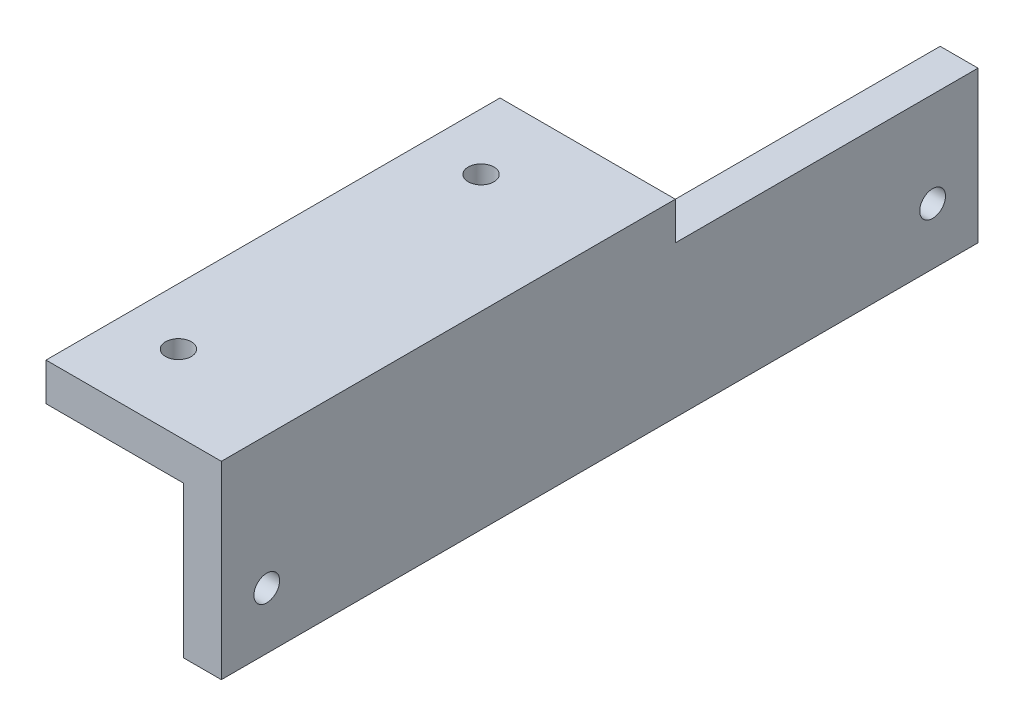
ISO-10303-21;
HEADER;
FILE_DESCRIPTION(('STEP AP214'),'2;1');
FILE_NAME('part.step','',(''),(''),'','','');
FILE_SCHEMA(('AUTOMOTIVE_DESIGN { 1 0 10303 214 1 1 1 1 }'));
ENDSEC;
DATA;
#1=APPLICATION_CONTEXT('core data for automotive mechanical design processes');
#2=APPLICATION_PROTOCOL_DEFINITION('international standard','automotive_design',2000,#1);
#3=PRODUCT_CONTEXT('',#1,'mechanical');
#4=PRODUCT('Part','Part','',(#3));
#5=PRODUCT_RELATED_PRODUCT_CATEGORY('part','',(#4));
#6=PRODUCT_DEFINITION_FORMATION('','',#4);
#7=PRODUCT_DEFINITION_CONTEXT('part definition',#1,'design');
#8=PRODUCT_DEFINITION('design','',#6,#7);
#9=PRODUCT_DEFINITION_SHAPE('','',#8);
#10=(LENGTH_UNIT() NAMED_UNIT(*) SI_UNIT(.MILLI.,.METRE.));
#11=(NAMED_UNIT(*) PLANE_ANGLE_UNIT() SI_UNIT($,.RADIAN.));
#12=(NAMED_UNIT(*) SI_UNIT($,.STERADIAN.) SOLID_ANGLE_UNIT());
#13=UNCERTAINTY_MEASURE_WITH_UNIT(LENGTH_MEASURE(1.E-05),#10,'distance_accuracy_value','');
#14=(GEOMETRIC_REPRESENTATION_CONTEXT(3) GLOBAL_UNCERTAINTY_ASSIGNED_CONTEXT((#13)) GLOBAL_UNIT_ASSIGNED_CONTEXT((#10,
#11,#12)) REPRESENTATION_CONTEXT('',''));
#15=CARTESIAN_POINT('',(0.,0.,0.));
#16=DIRECTION('',(0.,0.,1.));
#17=DIRECTION('',(1.,0.,0.));
#18=AXIS2_PLACEMENT_3D('',#15,#16,#17);
#19=CARTESIAN_POINT('',(2.5,20.,0.));
#20=DIRECTION('',(0.,1.,0.));
#21=DIRECTION('',(0.,0.,1.));
#22=AXIS2_PLACEMENT_3D('',#19,#20,#21);
#23=PLANE('',#22);
#24=DIRECTION('',(0.,0.,-1.));
#25=VECTOR('',#24,1.);
#26=CARTESIAN_POINT('',(-2.5,20.,0.));
#27=LINE('',#26,#25);
#28=CARTESIAN_POINT('',(-2.5,20.,-60.));
#29=VERTEX_POINT('',#28);
#30=CARTESIAN_POINT('',(-2.5,20.,-100.));
#31=VERTEX_POINT('',#30);
#32=EDGE_CURVE('E233',#29,#31,#27,.T.);
#33=ORIENTED_EDGE('',*,*,#32,.F.);
#34=DIRECTION('',(1.,0.,0.));
#35=VECTOR('',#34,1.);
#36=CARTESIAN_POINT('',(0.,20.,-60.));
#37=LINE('',#36,#35);
#38=CARTESIAN_POINT('',(2.5,20.,-60.));
#39=VERTEX_POINT('',#38);
#40=EDGE_CURVE('E11',#29,#39,#37,.T.);
#41=ORIENTED_EDGE('',*,*,#40,.T.);
#42=DIRECTION('',(0.,0.,-1.));
#43=VECTOR('',#42,1.);
#44=CARTESIAN_POINT('',(2.5,20.,0.));
#45=LINE('',#44,#43);
#46=CARTESIAN_POINT('',(2.5,20.,-100.));
#47=VERTEX_POINT('',#46);
#48=EDGE_CURVE('E185',#39,#47,#45,.T.);
#49=ORIENTED_EDGE('',*,*,#48,.T.);
#50=DIRECTION('',(-1.,0.,0.));
#51=VECTOR('',#50,1.);
#52=CARTESIAN_POINT('',(2.5,20.,-100.));
#53=LINE('',#52,#51);
#54=EDGE_CURVE('E351',#47,#31,#53,.T.);
#55=ORIENTED_EDGE('',*,*,#54,.T.);
#56=EDGE_LOOP('',(#33,#41,#49,#55));
#57=FACE_BOUND('',#56,.T.);
#58=ADVANCED_FACE('F36',(#57),#23,.T.);
#59=CARTESIAN_POINT('',(0.,0.,0.));
#60=DIRECTION('',(1.,0.,0.));
#61=DIRECTION('',(0.,0.,-1.));
#62=AXIS2_PLACEMENT_3D('',#59,#60,#61);
#63=PLANE('',#62);
#64=CARTESIAN_POINT('',(0.,7.49999999999999,-6.00000000000001));
#65=DIRECTION('',(1.,0.,0.));
#66=DIRECTION('',(0.,0.,-1.));
#67=AXIS2_PLACEMENT_3D('',#64,#65,#66);
#68=CIRCLE('',#67,1.7);
#69=CARTESIAN_POINT('',(0.,7.49999999999999,-7.70000000000001));
#70=VERTEX_POINT('',#69);
#71=EDGE_CURVE('E302',#70,#70,#68,.T.);
#72=ORIENTED_EDGE('',*,*,#71,.T.);
#73=EDGE_LOOP('',(#72));
#74=FACE_BOUND('',#73,.T.);
#75=DIRECTION('',(0.,0.866025403784439,-0.5));
#76=VECTOR('',#75,1.);
#77=CARTESIAN_POINT('',(0.,-2.12307621135332,-3.6772758664048));
#78=LINE('',#77,#76);
#79=CARTESIAN_POINT('',(0.,4.69999999999999,-7.61658075373096));
#80=VERTEX_POINT('',#79);
#81=CARTESIAN_POINT('',(0.,7.49999999999999,-9.23316150746191));
#82=VERTEX_POINT('',#81);
#83=EDGE_CURVE('E60',#80,#82,#78,.T.);
#84=ORIENTED_EDGE('',*,*,#83,.F.);
#85=DIRECTION('',(0.,0.,-1.));
#86=VECTOR('',#85,1.);
#87=CARTESIAN_POINT('',(0.,4.69999999999999,0.));
#88=LINE('',#87,#86);
#89=CARTESIAN_POINT('',(0.,4.69999999999999,-4.38341924626905));
#90=VERTEX_POINT('',#89);
#91=EDGE_CURVE('E268',#90,#80,#88,.T.);
#92=ORIENTED_EDGE('',*,*,#91,.F.);
#93=DIRECTION('',(0.,-0.866025403784439,-0.5));
#94=VECTOR('',#93,1.);
#95=CARTESIAN_POINT('',(0.,3.07307621135331,-5.32272413359521));
#96=LINE('',#95,#94);
#97=CARTESIAN_POINT('',(0.,7.49999999999999,-2.76683849253809));
#98=VERTEX_POINT('',#97);
#99=EDGE_CURVE('E270',#98,#90,#96,.T.);
#100=ORIENTED_EDGE('',*,*,#99,.F.);
#101=DIRECTION('',(0.,-0.866025403784439,0.5));
#102=VECTOR('',#101,1.);
#103=CARTESIAN_POINT('',(0.,0.676923788646683,1.17246639478807));
#104=LINE('',#103,#102);
#105=CARTESIAN_POINT('',(0.,10.3,-4.38341924626905));
#106=VERTEX_POINT('',#105);
#107=EDGE_CURVE('E273',#106,#98,#104,.T.);
#108=ORIENTED_EDGE('',*,*,#107,.F.);
#109=DIRECTION('',(0.,0.,1.));
#110=VECTOR('',#109,1.);
#111=CARTESIAN_POINT('',(0.,10.3,0.));
#112=LINE('',#111,#110);
#113=CARTESIAN_POINT('',(0.,10.3,-7.61658075373096));
#114=VERTEX_POINT('',#113);
#115=EDGE_CURVE('E276',#114,#106,#112,.T.);
#116=ORIENTED_EDGE('',*,*,#115,.F.);
#117=DIRECTION('',(0.,0.866025403784439,0.5));
#118=VECTOR('',#117,1.);
#119=CARTESIAN_POINT('',(0.,5.87307621135332,-10.1724663947881));
#120=LINE('',#119,#118);
#121=EDGE_CURVE('E279',#82,#114,#120,.T.);
#122=ORIENTED_EDGE('',*,*,#121,.F.);
#123=EDGE_LOOP('',(#84,#92,#100,#108,#116,#122));
#124=FACE_BOUND('',#123,.T.);
#125=ADVANCED_FACE('F386',(#74,#124),#63,.F.);
#126=CARTESIAN_POINT('',(0.,7.50000000000001,-94.));
#127=DIRECTION('',(1.,0.,0.));
#128=DIRECTION('',(0.,0.,-1.));
#129=AXIS2_PLACEMENT_3D('',#126,#127,#128);
#130=CIRCLE('',#129,1.70000000000001);
#131=CARTESIAN_POINT('',(0.,7.50000000000001,-95.7));
#132=VERTEX_POINT('',#131);
#133=EDGE_CURVE('E338',#132,#132,#130,.T.);
#134=ORIENTED_EDGE('',*,*,#133,.T.);
#135=EDGE_LOOP('',(#134));
#136=FACE_BOUND('',#135,.T.);
#137=DIRECTION('',(0.,-0.866025403784438,-0.500000000000002));
#138=VECTOR('',#137,1.);
#139=CARTESIAN_POINT('',(0.,41.1781939778687,-71.3227241335951));
#140=LINE('',#139,#138);
#141=CARTESIAN_POINT('',(0.,7.50000000000002,-90.7668384925381));
#142=VERTEX_POINT('',#141);
#143=CARTESIAN_POINT('',(0.,4.69999999999998,-92.383419246269));
#144=VERTEX_POINT('',#143);
#145=EDGE_CURVE('E282',#142,#144,#140,.T.);
#146=ORIENTED_EDGE('',*,*,#145,.F.);
#147=DIRECTION('',(0.,-0.866025403784438,0.500000000000002));
#148=VECTOR('',#147,1.);
#149=CARTESIAN_POINT('',(0.,-37.4281939778687,-64.8275336052118));
#150=LINE('',#149,#148);
#151=CARTESIAN_POINT('',(0.,10.3,-92.383419246269));
#152=VERTEX_POINT('',#151);
#153=EDGE_CURVE('E285',#152,#142,#150,.T.);
#154=ORIENTED_EDGE('',*,*,#153,.F.);
#155=DIRECTION('',(0.,0.,1.));
#156=VECTOR('',#155,1.);
#157=CARTESIAN_POINT('',(0.,10.3,0.));
#158=LINE('',#157,#156);
#159=CARTESIAN_POINT('',(0.,10.3,-95.6165807537309));
#160=VERTEX_POINT('',#159);
#161=EDGE_CURVE('E288',#160,#152,#158,.T.);
#162=ORIENTED_EDGE('',*,*,#161,.F.);
#163=DIRECTION('',(0.,0.866025403784439,0.499999999999999));
#164=VECTOR('',#163,1.);
#165=CARTESIAN_POINT('',(0.,43.9781939778686,-76.1724663947882));
#166=LINE('',#165,#164);
#167=CARTESIAN_POINT('',(0.,7.50000000000001,-97.2331615074619));
#168=VERTEX_POINT('',#167);
#169=EDGE_CURVE('E291',#168,#160,#166,.T.);
#170=ORIENTED_EDGE('',*,*,#169,.F.);
#171=DIRECTION('',(0.,0.866025403784438,-0.5));
#172=VECTOR('',#171,1.);
#173=CARTESIAN_POINT('',(0.,-40.2281939778686,-69.6772758664048));
#174=LINE('',#173,#172);
#175=CARTESIAN_POINT('',(0.,4.69999999999998,-95.6165807537309));
#176=VERTEX_POINT('',#175);
#177=EDGE_CURVE('E294',#176,#168,#174,.T.);
#178=ORIENTED_EDGE('',*,*,#177,.F.);
#179=DIRECTION('',(0.,0.,-1.));
#180=VECTOR('',#179,1.);
#181=CARTESIAN_POINT('',(0.,4.70000000000001,0.));
#182=LINE('',#181,#180);
#183=EDGE_CURVE('E230',#144,#176,#182,.T.);
#184=ORIENTED_EDGE('',*,*,#183,.F.);
#185=EDGE_LOOP('',(#146,#154,#162,#170,#178,#184));
#186=FACE_BOUND('',#185,.T.);
#187=ADVANCED_FACE('F391',(#136,#186),#63,.F.);
#188=CARTESIAN_POINT('',(2.5,0.,0.));
#189=DIRECTION('',(0.,1.,0.));
#190=DIRECTION('',(0.,0.,1.));
#191=AXIS2_PLACEMENT_3D('',#188,#189,#190);
#192=PLANE('',#191);
#193=DIRECTION('',(-1.,0.,0.));
#194=VECTOR('',#193,1.);
#195=CARTESIAN_POINT('',(2.5,0.,0.));
#196=LINE('',#195,#194);
#197=CARTESIAN_POINT('',(2.5,0.,0.));
#198=VERTEX_POINT('',#197);
#199=CARTESIAN_POINT('',(-2.5,0.,0.));
#200=VERTEX_POINT('',#199);
#201=EDGE_CURVE('E180',#198,#200,#196,.T.);
#202=ORIENTED_EDGE('',*,*,#201,.T.);
#203=DIRECTION('',(0.,0.,-1.));
#204=VECTOR('',#203,1.);
#205=CARTESIAN_POINT('',(-2.5,0.,0.));
#206=LINE('',#205,#204);
#207=CARTESIAN_POINT('',(-2.5,0.,-100.));
#208=VERTEX_POINT('',#207);
#209=EDGE_CURVE('E226',#200,#208,#206,.T.);
#210=ORIENTED_EDGE('',*,*,#209,.T.);
#211=DIRECTION('',(-1.,0.,0.));
#212=VECTOR('',#211,1.);
#213=CARTESIAN_POINT('',(2.5,0.,-100.));
#214=LINE('',#213,#212);
#215=CARTESIAN_POINT('',(2.5,0.,-100.));
#216=VERTEX_POINT('',#215);
#217=EDGE_CURVE('E40',#216,#208,#214,.T.);
#218=ORIENTED_EDGE('',*,*,#217,.F.);
#219=DIRECTION('',(0.,0.,-1.));
#220=VECTOR('',#219,1.);
#221=CARTESIAN_POINT('',(2.5,0.,0.));
#222=LINE('',#221,#220);
#223=EDGE_CURVE('E335',#198,#216,#222,.T.);
#224=ORIENTED_EDGE('',*,*,#223,.F.);
#225=EDGE_LOOP('',(#202,#210,#218,#224));
#226=FACE_BOUND('',#225,.T.);
#227=ADVANCED_FACE('F38',(#226),#192,.F.);
#228=CARTESIAN_POINT('',(2.5,0.,-100.));
#229=DIRECTION('',(0.,0.,1.));
#230=DIRECTION('',(0.,-1.,0.));
#231=AXIS2_PLACEMENT_3D('',#228,#229,#230);
#232=PLANE('',#231);
#233=ORIENTED_EDGE('',*,*,#217,.T.);
#234=DIRECTION('',(0.,1.,0.));
#235=VECTOR('',#234,1.);
#236=CARTESIAN_POINT('',(-2.5,0.,-100.));
#237=LINE('',#236,#235);
#238=EDGE_CURVE('E229',#208,#31,#237,.T.);
#239=ORIENTED_EDGE('',*,*,#238,.T.);
#240=ORIENTED_EDGE('',*,*,#54,.F.);
#241=DIRECTION('',(0.,1.,0.));
#242=VECTOR('',#241,1.);
#243=CARTESIAN_POINT('',(2.5,0.,-100.));
#244=LINE('',#243,#242);
#245=EDGE_CURVE('E337',#216,#47,#244,.T.);
#246=ORIENTED_EDGE('',*,*,#245,.F.);
#247=EDGE_LOOP('',(#233,#239,#240,#246));
#248=FACE_BOUND('',#247,.T.);
#249=ADVANCED_FACE('F359',(#248),#232,.F.);
#250=CARTESIAN_POINT('',(2.5,7.49999999999999,-6.00000000000001));
#251=DIRECTION('',(-1.,0.,0.));
#252=DIRECTION('',(0.,0.,1.));
#253=AXIS2_PLACEMENT_3D('',#250,#251,#252);
#254=CYLINDRICAL_SURFACE('',#253,1.7);
#255=CARTESIAN_POINT('',(2.5,7.49999999999999,-6.00000000000001));
#256=DIRECTION('',(1.,0.,0.));
#257=DIRECTION('',(0.,0.,-1.));
#258=AXIS2_PLACEMENT_3D('',#255,#256,#257);
#259=CIRCLE('',#258,1.7);
#260=CARTESIAN_POINT('',(2.5,7.49999999999999,-7.70000000000001));
#261=VERTEX_POINT('',#260);
#262=EDGE_CURVE('E184',#261,#261,#259,.T.);
#263=ORIENTED_EDGE('',*,*,#262,.T.);
#264=EDGE_LOOP('',(#263));
#265=FACE_BOUND('',#264,.T.);
#266=ORIENTED_EDGE('',*,*,#71,.F.);
#267=EDGE_LOOP('',(#266));
#268=FACE_BOUND('',#267,.T.);
#269=ADVANCED_FACE('F397',(#265,#268),#254,.F.);
#270=CARTESIAN_POINT('',(2.5,0.,0.));
#271=DIRECTION('',(0.,0.,1.));
#272=DIRECTION('',(1.,0.,0.));
#273=AXIS2_PLACEMENT_3D('',#270,#271,#272);
#274=PLANE('',#273);
#275=DIRECTION('',(0.,1.,0.));
#276=VECTOR('',#275,1.);
#277=CARTESIAN_POINT('',(2.5,0.,0.));
#278=LINE('',#277,#276);
#279=CARTESIAN_POINT('',(2.5,25.,0.));
#280=VERTEX_POINT('',#279);
#281=EDGE_CURVE('E172',#198,#280,#278,.T.);
#282=ORIENTED_EDGE('',*,*,#281,.T.);
#283=DIRECTION('',(-1.,0.,0.));
#284=VECTOR('',#283,1.);
#285=CARTESIAN_POINT('',(0.,25.,0.));
#286=LINE('',#285,#284);
#287=CARTESIAN_POINT('',(-20.675,25.,0.));
#288=VERTEX_POINT('',#287);
#289=EDGE_CURVE('E177',#280,#288,#286,.T.);
#290=ORIENTED_EDGE('',*,*,#289,.T.);
#291=DIRECTION('',(0.,-1.,0.));
#292=VECTOR('',#291,1.);
#293=CARTESIAN_POINT('',(-20.675,25.,0.));
#294=LINE('',#293,#292);
#295=CARTESIAN_POINT('',(-20.675,20.,0.));
#296=VERTEX_POINT('',#295);
#297=EDGE_CURVE('E210',#288,#296,#294,.T.);
#298=ORIENTED_EDGE('',*,*,#297,.T.);
#299=DIRECTION('',(-1.,0.,0.));
#300=VECTOR('',#299,1.);
#301=CARTESIAN_POINT('',(0.,20.,0.));
#302=LINE('',#301,#300);
#303=CARTESIAN_POINT('',(-2.5,20.,0.));
#304=VERTEX_POINT('',#303);
#305=EDGE_CURVE('E214',#304,#296,#302,.T.);
#306=ORIENTED_EDGE('',*,*,#305,.F.);
#307=DIRECTION('',(0.,1.,0.));
#308=VECTOR('',#307,1.);
#309=CARTESIAN_POINT('',(-2.5,0.,0.));
#310=LINE('',#309,#308);
#311=EDGE_CURVE('E237',#200,#304,#310,.T.);
#312=ORIENTED_EDGE('',*,*,#311,.F.);
#313=ORIENTED_EDGE('',*,*,#201,.F.);
#314=EDGE_LOOP('',(#282,#290,#298,#306,#312,#313));
#315=FACE_BOUND('',#314,.T.);
#316=ADVANCED_FACE('F174',(#315),#274,.T.);
#317=CARTESIAN_POINT('',(2.5,7.50000000000001,-94.));
#318=DIRECTION('',(-1.,0.,0.));
#319=DIRECTION('',(0.,0.,1.));
#320=AXIS2_PLACEMENT_3D('',#317,#318,#319);
#321=CYLINDRICAL_SURFACE('',#320,1.70000000000001);
#322=CARTESIAN_POINT('',(2.5,7.50000000000001,-94.));
#323=DIRECTION('',(1.,0.,0.));
#324=DIRECTION('',(0.,0.,-1.));
#325=AXIS2_PLACEMENT_3D('',#322,#323,#324);
#326=CIRCLE('',#325,1.70000000000001);
#327=CARTESIAN_POINT('',(2.5,7.50000000000001,-95.7));
#328=VERTEX_POINT('',#327);
#329=EDGE_CURVE('E344',#328,#328,#326,.T.);
#330=ORIENTED_EDGE('',*,*,#329,.T.);
#331=EDGE_LOOP('',(#330));
#332=FACE_BOUND('',#331,.T.);
#333=ORIENTED_EDGE('',*,*,#133,.F.);
#334=EDGE_LOOP('',(#333));
#335=FACE_BOUND('',#334,.T.);
#336=ADVANCED_FACE('F413',(#332,#335),#321,.F.);
#337=CARTESIAN_POINT('',(2.5,0.,0.));
#338=DIRECTION('',(1.,0.,0.));
#339=DIRECTION('',(0.,0.,-1.));
#340=AXIS2_PLACEMENT_3D('',#337,#338,#339);
#341=PLANE('',#340);
#342=ORIENTED_EDGE('',*,*,#223,.T.);
#343=ORIENTED_EDGE('',*,*,#245,.T.);
#344=ORIENTED_EDGE('',*,*,#48,.F.);
#345=DIRECTION('',(0.,-1.,0.));
#346=VECTOR('',#345,1.);
#347=CARTESIAN_POINT('',(2.5,25.,-60.));
#348=LINE('',#347,#346);
#349=CARTESIAN_POINT('',(2.5,25.,-60.));
#350=VERTEX_POINT('',#349);
#351=EDGE_CURVE('E53',#350,#39,#348,.T.);
#352=ORIENTED_EDGE('',*,*,#351,.F.);
#353=DIRECTION('',(0.,0.,-1.));
#354=VECTOR('',#353,1.);
#355=CARTESIAN_POINT('',(2.5,25.,0.));
#356=LINE('',#355,#354);
#357=EDGE_CURVE('E187',#280,#350,#356,.T.);
#358=ORIENTED_EDGE('',*,*,#357,.F.);
#359=ORIENTED_EDGE('',*,*,#281,.F.);
#360=EDGE_LOOP('',(#342,#343,#344,#352,#358,#359));
#361=FACE_BOUND('',#360,.T.);
#362=ORIENTED_EDGE('',*,*,#262,.F.);
#363=EDGE_LOOP('',(#362));
#364=FACE_BOUND('',#363,.T.);
#365=ORIENTED_EDGE('',*,*,#329,.F.);
#366=EDGE_LOOP('',(#365));
#367=FACE_BOUND('',#366,.T.);
#368=ADVANCED_FACE('F188',(#361,#364,#367),#341,.T.);
#369=CARTESIAN_POINT('',(-2.5,41.1781939778687,-71.3227241335951));
#370=DIRECTION('',(0.,-0.500000000000002,0.866025403784438));
#371=DIRECTION('',(0.,-0.866025403784438,-0.500000000000002));
#372=AXIS2_PLACEMENT_3D('',#369,#370,#371);
#373=PLANE('',#372);
#374=ORIENTED_EDGE('',*,*,#145,.T.);
#375=DIRECTION('',(1.,0.,0.));
#376=VECTOR('',#375,1.);
#377=CARTESIAN_POINT('',(-2.5,4.69999999999998,-92.383419246269));
#378=LINE('',#377,#376);
#379=CARTESIAN_POINT('',(-2.5,4.69999999999998,-92.383419246269));
#380=VERTEX_POINT('',#379);
#381=EDGE_CURVE('E299',#380,#144,#378,.T.);
#382=ORIENTED_EDGE('',*,*,#381,.F.);
#383=DIRECTION('',(0.,-0.866025403784438,-0.500000000000002));
#384=VECTOR('',#383,1.);
#385=CARTESIAN_POINT('',(-2.5,41.1781939778687,-71.3227241335951));
#386=LINE('',#385,#384);
#387=CARTESIAN_POINT('',(-2.5,7.50000000000002,-90.7668384925381));
#388=VERTEX_POINT('',#387);
#389=EDGE_CURVE('E253',#388,#380,#386,.T.);
#390=ORIENTED_EDGE('',*,*,#389,.F.);
#391=DIRECTION('',(1.,0.,0.));
#392=VECTOR('',#391,1.);
#393=CARTESIAN_POINT('',(-2.5,7.50000000000002,-90.7668384925381));
#394=LINE('',#393,#392);
#395=EDGE_CURVE('E315',#388,#142,#394,.T.);
#396=ORIENTED_EDGE('',*,*,#395,.T.);
#397=EDGE_LOOP('',(#374,#382,#390,#396));
#398=FACE_BOUND('',#397,.T.);
#399=ADVANCED_FACE('F420',(#398),#373,.F.);
#400=CARTESIAN_POINT('',(-2.5,4.70000000000001,0.));
#401=DIRECTION('',(0.,-1.,0.));
#402=DIRECTION('',(0.,0.,-1.));
#403=AXIS2_PLACEMENT_3D('',#400,#401,#402);
#404=PLANE('',#403);
#405=ORIENTED_EDGE('',*,*,#183,.T.);
#406=DIRECTION('',(1.,0.,0.));
#407=VECTOR('',#406,1.);
#408=CARTESIAN_POINT('',(-2.5,4.69999999999998,-95.6165807537309));
#409=LINE('',#408,#407);
#410=CARTESIAN_POINT('',(-2.5,4.69999999999998,-95.6165807537309));
#411=VERTEX_POINT('',#410);
#412=EDGE_CURVE('E303',#411,#176,#409,.T.);
#413=ORIENTED_EDGE('',*,*,#412,.F.);
#414=DIRECTION('',(0.,0.,-1.));
#415=VECTOR('',#414,1.);
#416=CARTESIAN_POINT('',(-2.5,4.70000000000001,0.));
#417=LINE('',#416,#415);
#418=EDGE_CURVE('E264',#380,#411,#417,.T.);
#419=ORIENTED_EDGE('',*,*,#418,.F.);
#420=ORIENTED_EDGE('',*,*,#381,.T.);
#421=EDGE_LOOP('',(#405,#413,#419,#420));
#422=FACE_BOUND('',#421,.T.);
#423=ADVANCED_FACE('F471',(#422),#404,.F.);
#424=CARTESIAN_POINT('',(-2.5,-40.2281939778686,-69.6772758664048));
#425=DIRECTION('',(0.,-0.5,-0.866025403784438));
#426=DIRECTION('',(0.,0.866025403784438,-0.5));
#427=AXIS2_PLACEMENT_3D('',#424,#425,#426);
#428=PLANE('',#427);
#429=ORIENTED_EDGE('',*,*,#177,.T.);
#430=DIRECTION('',(1.,0.,0.));
#431=VECTOR('',#430,1.);
#432=CARTESIAN_POINT('',(-2.5,7.50000000000001,-97.2331615074619));
#433=LINE('',#432,#431);
#434=CARTESIAN_POINT('',(-2.5,7.50000000000001,-97.2331615074619));
#435=VERTEX_POINT('',#434);
#436=EDGE_CURVE('E306',#435,#168,#433,.T.);
#437=ORIENTED_EDGE('',*,*,#436,.F.);
#438=DIRECTION('',(0.,0.866025403784438,-0.5));
#439=VECTOR('',#438,1.);
#440=CARTESIAN_POINT('',(-2.5,-40.2281939778686,-69.6772758664048));
#441=LINE('',#440,#439);
#442=EDGE_CURVE('E262',#411,#435,#441,.T.);
#443=ORIENTED_EDGE('',*,*,#442,.F.);
#444=ORIENTED_EDGE('',*,*,#412,.T.);
#445=EDGE_LOOP('',(#429,#437,#443,#444));
#446=FACE_BOUND('',#445,.T.);
#447=ADVANCED_FACE('F481',(#446),#428,.F.);
#448=CARTESIAN_POINT('',(-2.5,43.9781939778686,-76.1724663947882));
#449=DIRECTION('',(0.,0.499999999999999,-0.866025403784439));
#450=DIRECTION('',(0.,0.866025403784439,0.499999999999999));
#451=AXIS2_PLACEMENT_3D('',#448,#449,#450);
#452=PLANE('',#451);
#453=ORIENTED_EDGE('',*,*,#169,.T.);
#454=DIRECTION('',(1.,0.,0.));
#455=VECTOR('',#454,1.);
#456=CARTESIAN_POINT('',(-2.5,10.3,-95.6165807537309));
#457=LINE('',#456,#455);
#458=CARTESIAN_POINT('',(-2.5,10.3,-95.6165807537309));
#459=VERTEX_POINT('',#458);
#460=EDGE_CURVE('E309',#459,#160,#457,.T.);
#461=ORIENTED_EDGE('',*,*,#460,.F.);
#462=DIRECTION('',(0.,0.866025403784439,0.499999999999999));
#463=VECTOR('',#462,1.);
#464=CARTESIAN_POINT('',(-2.5,43.9781939778686,-76.1724663947882));
#465=LINE('',#464,#463);
#466=EDGE_CURVE('E260',#435,#459,#465,.T.);
#467=ORIENTED_EDGE('',*,*,#466,.F.);
#468=ORIENTED_EDGE('',*,*,#436,.T.);
#469=EDGE_LOOP('',(#453,#461,#467,#468));
#470=FACE_BOUND('',#469,.T.);
#471=ADVANCED_FACE('F491',(#470),#452,.F.);
#472=CARTESIAN_POINT('',(-2.5,10.3,0.));
#473=DIRECTION('',(0.,1.,0.));
#474=DIRECTION('',(0.,0.,1.));
#475=AXIS2_PLACEMENT_3D('',#472,#473,#474);
#476=PLANE('',#475);
#477=ORIENTED_EDGE('',*,*,#161,.T.);
#478=DIRECTION('',(1.,0.,0.));
#479=VECTOR('',#478,1.);
#480=CARTESIAN_POINT('',(-2.5,10.3,-92.383419246269));
#481=LINE('',#480,#479);
#482=CARTESIAN_POINT('',(-2.5,10.3,-92.383419246269));
#483=VERTEX_POINT('',#482);
#484=EDGE_CURVE('E312',#483,#152,#481,.T.);
#485=ORIENTED_EDGE('',*,*,#484,.F.);
#486=DIRECTION('',(0.,0.,1.));
#487=VECTOR('',#486,1.);
#488=CARTESIAN_POINT('',(-2.5,10.3,0.));
#489=LINE('',#488,#487);
#490=EDGE_CURVE('E258',#459,#483,#489,.T.);
#491=ORIENTED_EDGE('',*,*,#490,.F.);
#492=ORIENTED_EDGE('',*,*,#460,.T.);
#493=EDGE_LOOP('',(#477,#485,#491,#492));
#494=FACE_BOUND('',#493,.T.);
#495=ADVANCED_FACE('F501',(#494),#476,.F.);
#496=CARTESIAN_POINT('',(-2.5,-2.12307621135332,-3.6772758664048));
#497=DIRECTION('',(0.,-0.5,-0.866025403784439));
#498=DIRECTION('',(0.,0.866025403784439,-0.5));
#499=AXIS2_PLACEMENT_3D('',#496,#497,#498);
#500=PLANE('',#499);
#501=ORIENTED_EDGE('',*,*,#83,.T.);
#502=DIRECTION('',(1.,0.,0.));
#503=VECTOR('',#502,1.);
#504=CARTESIAN_POINT('',(-2.5,7.49999999999999,-9.23316150746191));
#505=LINE('',#504,#503);
#506=CARTESIAN_POINT('',(-2.5,7.49999999999999,-9.23316150746191));
#507=VERTEX_POINT('',#506);
#508=EDGE_CURVE('E318',#507,#82,#505,.T.);
#509=ORIENTED_EDGE('',*,*,#508,.F.);
#510=DIRECTION('',(0.,0.866025403784439,-0.5));
#511=VECTOR('',#510,1.);
#512=CARTESIAN_POINT('',(-2.5,-2.12307621135332,-3.6772758664048));
#513=LINE('',#512,#511);
#514=CARTESIAN_POINT('',(-2.5,4.69999999999999,-7.61658075373096));
#515=VERTEX_POINT('',#514);
#516=EDGE_CURVE('E240',#515,#507,#513,.T.);
#517=ORIENTED_EDGE('',*,*,#516,.F.);
#518=DIRECTION('',(1.,0.,0.));
#519=VECTOR('',#518,1.);
#520=CARTESIAN_POINT('',(-2.5,4.69999999999999,-7.61658075373096));
#521=LINE('',#520,#519);
#522=EDGE_CURVE('E266',#515,#80,#521,.T.);
#523=ORIENTED_EDGE('',*,*,#522,.T.);
#524=EDGE_LOOP('',(#501,#509,#517,#523));
#525=FACE_BOUND('',#524,.T.);
#526=ADVANCED_FACE('F511',(#525),#500,.F.);
#527=CARTESIAN_POINT('',(-2.5,5.87307621135332,-10.1724663947881));
#528=DIRECTION('',(0.,0.5,-0.866025403784439));
#529=DIRECTION('',(0.,0.866025403784439,0.5));
#530=AXIS2_PLACEMENT_3D('',#527,#528,#529);
#531=PLANE('',#530);
#532=ORIENTED_EDGE('',*,*,#121,.T.);
#533=DIRECTION('',(1.,0.,0.));
#534=VECTOR('',#533,1.);
#535=CARTESIAN_POINT('',(-2.5,10.3,-7.61658075373096));
#536=LINE('',#535,#534);
#537=CARTESIAN_POINT('',(-2.5,10.3,-7.61658075373096));
#538=VERTEX_POINT('',#537);
#539=EDGE_CURVE('E321',#538,#114,#536,.T.);
#540=ORIENTED_EDGE('',*,*,#539,.F.);
#541=DIRECTION('',(0.,0.866025403784439,0.5));
#542=VECTOR('',#541,1.);
#543=CARTESIAN_POINT('',(-2.5,5.87307621135332,-10.1724663947881));
#544=LINE('',#543,#542);
#545=EDGE_CURVE('E251',#507,#538,#544,.T.);
#546=ORIENTED_EDGE('',*,*,#545,.F.);
#547=ORIENTED_EDGE('',*,*,#508,.T.);
#548=EDGE_LOOP('',(#532,#540,#546,#547));
#549=FACE_BOUND('',#548,.T.);
#550=ADVANCED_FACE('F521',(#549),#531,.F.);
#551=CARTESIAN_POINT('',(-2.5,10.3,0.));
#552=DIRECTION('',(0.,1.,0.));
#553=DIRECTION('',(0.,0.,1.));
#554=AXIS2_PLACEMENT_3D('',#551,#552,#553);
#555=PLANE('',#554);
#556=ORIENTED_EDGE('',*,*,#115,.T.);
#557=DIRECTION('',(1.,0.,0.));
#558=VECTOR('',#557,1.);
#559=CARTESIAN_POINT('',(-2.5,10.3,-4.38341924626905));
#560=LINE('',#559,#558);
#561=CARTESIAN_POINT('',(-2.5,10.3,-4.38341924626905));
#562=VERTEX_POINT('',#561);
#563=EDGE_CURVE('E324',#562,#106,#560,.T.);
#564=ORIENTED_EDGE('',*,*,#563,.F.);
#565=DIRECTION('',(0.,0.,1.));
#566=VECTOR('',#565,1.);
#567=CARTESIAN_POINT('',(-2.5,10.3,0.));
#568=LINE('',#567,#566);
#569=EDGE_CURVE('E249',#538,#562,#568,.T.);
#570=ORIENTED_EDGE('',*,*,#569,.F.);
#571=ORIENTED_EDGE('',*,*,#539,.T.);
#572=EDGE_LOOP('',(#556,#564,#570,#571));
#573=FACE_BOUND('',#572,.T.);
#574=ADVANCED_FACE('F530',(#573),#555,.F.);
#575=CARTESIAN_POINT('',(-2.5,0.676923788646683,1.17246639478807));
#576=DIRECTION('',(0.,0.5,0.866025403784439));
#577=DIRECTION('',(0.,-0.866025403784439,0.5));
#578=AXIS2_PLACEMENT_3D('',#575,#576,#577);
#579=PLANE('',#578);
#580=ORIENTED_EDGE('',*,*,#107,.T.);
#581=DIRECTION('',(1.,0.,0.));
#582=VECTOR('',#581,1.);
#583=CARTESIAN_POINT('',(-2.5,7.49999999999999,-2.76683849253809));
#584=LINE('',#583,#582);
#585=CARTESIAN_POINT('',(-2.5,7.49999999999999,-2.76683849253809));
#586=VERTEX_POINT('',#585);
#587=EDGE_CURVE('E327',#586,#98,#584,.T.);
#588=ORIENTED_EDGE('',*,*,#587,.F.);
#589=DIRECTION('',(0.,-0.866025403784439,0.5));
#590=VECTOR('',#589,1.);
#591=CARTESIAN_POINT('',(-2.5,0.676923788646683,1.17246639478807));
#592=LINE('',#591,#590);
#593=EDGE_CURVE('E247',#562,#586,#592,.T.);
#594=ORIENTED_EDGE('',*,*,#593,.F.);
#595=ORIENTED_EDGE('',*,*,#563,.T.);
#596=EDGE_LOOP('',(#580,#588,#594,#595));
#597=FACE_BOUND('',#596,.T.);
#598=ADVANCED_FACE('F540',(#597),#579,.F.);
#599=CARTESIAN_POINT('',(-2.5,3.07307621135331,-5.32272413359521));
#600=DIRECTION('',(0.,-0.5,0.866025403784439));
#601=DIRECTION('',(0.,-0.866025403784439,-0.5));
#602=AXIS2_PLACEMENT_3D('',#599,#600,#601);
#603=PLANE('',#602);
#604=ORIENTED_EDGE('',*,*,#99,.T.);
#605=DIRECTION('',(1.,0.,0.));
#606=VECTOR('',#605,1.);
#607=CARTESIAN_POINT('',(-2.5,4.69999999999999,-4.38341924626905));
#608=LINE('',#607,#606);
#609=CARTESIAN_POINT('',(-2.5,4.69999999999999,-4.38341924626905));
#610=VERTEX_POINT('',#609);
#611=EDGE_CURVE('E330',#610,#90,#608,.T.);
#612=ORIENTED_EDGE('',*,*,#611,.F.);
#613=DIRECTION('',(0.,-0.866025403784439,-0.5));
#614=VECTOR('',#613,1.);
#615=CARTESIAN_POINT('',(-2.5,3.07307621135331,-5.32272413359521));
#616=LINE('',#615,#614);
#617=EDGE_CURVE('E245',#586,#610,#616,.T.);
#618=ORIENTED_EDGE('',*,*,#617,.F.);
#619=ORIENTED_EDGE('',*,*,#587,.T.);
#620=EDGE_LOOP('',(#604,#612,#618,#619));
#621=FACE_BOUND('',#620,.T.);
#622=ADVANCED_FACE('F550',(#621),#603,.F.);
#623=CARTESIAN_POINT('',(-2.5,4.69999999999999,0.));
#624=DIRECTION('',(0.,-1.,0.));
#625=DIRECTION('',(0.,0.,-1.));
#626=AXIS2_PLACEMENT_3D('',#623,#624,#625);
#627=PLANE('',#626);
#628=ORIENTED_EDGE('',*,*,#91,.T.);
#629=ORIENTED_EDGE('',*,*,#522,.F.);
#630=DIRECTION('',(0.,0.,-1.));
#631=VECTOR('',#630,1.);
#632=CARTESIAN_POINT('',(-2.5,4.69999999999999,0.));
#633=LINE('',#632,#631);
#634=EDGE_CURVE('E243',#610,#515,#633,.T.);
#635=ORIENTED_EDGE('',*,*,#634,.F.);
#636=ORIENTED_EDGE('',*,*,#611,.T.);
#637=EDGE_LOOP('',(#628,#629,#635,#636));
#638=FACE_BOUND('',#637,.T.);
#639=ADVANCED_FACE('F560',(#638),#627,.F.);
#640=CARTESIAN_POINT('',(-2.5,-37.4281939778687,-64.8275336052118));
#641=DIRECTION('',(0.,0.500000000000002,0.866025403784438));
#642=DIRECTION('',(0.,-0.866025403784438,0.500000000000002));
#643=AXIS2_PLACEMENT_3D('',#640,#641,#642);
#644=PLANE('',#643);
#645=ORIENTED_EDGE('',*,*,#153,.T.);
#646=ORIENTED_EDGE('',*,*,#395,.F.);
#647=DIRECTION('',(0.,-0.866025403784438,0.500000000000002));
#648=VECTOR('',#647,1.);
#649=CARTESIAN_POINT('',(-2.5,-37.4281939778687,-64.8275336052118));
#650=LINE('',#649,#648);
#651=EDGE_CURVE('E256',#483,#388,#650,.T.);
#652=ORIENTED_EDGE('',*,*,#651,.F.);
#653=ORIENTED_EDGE('',*,*,#484,.T.);
#654=EDGE_LOOP('',(#645,#646,#652,#653));
#655=FACE_BOUND('',#654,.T.);
#656=ADVANCED_FACE('F382',(#655),#644,.F.);
#657=CARTESIAN_POINT('',(-2.5,0.,0.));
#658=DIRECTION('',(1.,0.,0.));
#659=DIRECTION('',(0.,0.,-1.));
#660=AXIS2_PLACEMENT_3D('',#657,#658,#659);
#661=PLANE('',#660);
#662=ORIENTED_EDGE('',*,*,#209,.F.);
#663=ORIENTED_EDGE('',*,*,#311,.T.);
#664=EDGE_CURVE('E234',#304,#29,#27,.T.);
#665=ORIENTED_EDGE('',*,*,#664,.T.);
#666=ORIENTED_EDGE('',*,*,#32,.T.);
#667=ORIENTED_EDGE('',*,*,#238,.F.);
#668=EDGE_LOOP('',(#662,#663,#665,#666,#667));
#669=FACE_BOUND('',#668,.T.);
#670=ORIENTED_EDGE('',*,*,#516,.T.);
#671=ORIENTED_EDGE('',*,*,#545,.T.);
#672=ORIENTED_EDGE('',*,*,#569,.T.);
#673=ORIENTED_EDGE('',*,*,#593,.T.);
#674=ORIENTED_EDGE('',*,*,#617,.T.);
#675=ORIENTED_EDGE('',*,*,#634,.T.);
#676=EDGE_LOOP('',(#670,#671,#672,#673,#674,#675));
#677=FACE_BOUND('',#676,.T.);
#678=ORIENTED_EDGE('',*,*,#389,.T.);
#679=ORIENTED_EDGE('',*,*,#418,.T.);
#680=ORIENTED_EDGE('',*,*,#442,.T.);
#681=ORIENTED_EDGE('',*,*,#466,.T.);
#682=ORIENTED_EDGE('',*,*,#490,.T.);
#683=ORIENTED_EDGE('',*,*,#651,.T.);
#684=EDGE_LOOP('',(#678,#679,#680,#681,#682,#683));
#685=FACE_BOUND('',#684,.T.);
#686=ADVANCED_FACE('F363',(#669,#677,#685),#661,.F.);
#687=CARTESIAN_POINT('',(0.,25.,-60.));
#688=DIRECTION('',(0.,0.,-1.));
#689=DIRECTION('',(-1.,0.,0.));
#690=AXIS2_PLACEMENT_3D('',#687,#688,#689);
#691=PLANE('',#690);
#692=CARTESIAN_POINT('',(-20.675,20.,-60.));
#693=VERTEX_POINT('',#692);
#694=EDGE_CURVE('E46',#693,#29,#37,.T.);
#695=ORIENTED_EDGE('',*,*,#694,.F.);
#696=DIRECTION('',(0.,-1.,0.));
#697=VECTOR('',#696,1.);
#698=CARTESIAN_POINT('',(-20.675,25.,-60.));
#699=LINE('',#698,#697);
#700=CARTESIAN_POINT('',(-20.675,25.,-60.));
#701=VERTEX_POINT('',#700);
#702=EDGE_CURVE('E223',#701,#693,#699,.T.);
#703=ORIENTED_EDGE('',*,*,#702,.F.);
#704=DIRECTION('',(1.,0.,0.));
#705=VECTOR('',#704,1.);
#706=CARTESIAN_POINT('',(0.,25.,-60.));
#707=LINE('',#706,#705);
#708=EDGE_CURVE('E193',#701,#350,#707,.T.);
#709=ORIENTED_EDGE('',*,*,#708,.T.);
#710=ORIENTED_EDGE('',*,*,#351,.T.);
#711=ORIENTED_EDGE('',*,*,#40,.F.);
#712=EDGE_LOOP('',(#695,#703,#709,#710,#711));
#713=FACE_BOUND('',#712,.T.);
#714=ADVANCED_FACE('F371',(#713),#691,.T.);
#715=CARTESIAN_POINT('',(-20.675,25.,0.));
#716=DIRECTION('',(-1.,0.,0.));
#717=DIRECTION('',(0.,0.,1.));
#718=AXIS2_PLACEMENT_3D('',#715,#716,#717);
#719=PLANE('',#718);
#720=DIRECTION('',(0.,0.,-1.));
#721=VECTOR('',#720,1.);
#722=CARTESIAN_POINT('',(-20.675,20.,0.));
#723=LINE('',#722,#721);
#724=EDGE_CURVE('E217',#296,#693,#723,.T.);
#725=ORIENTED_EDGE('',*,*,#724,.F.);
#726=ORIENTED_EDGE('',*,*,#297,.F.);
#727=DIRECTION('',(0.,0.,-1.));
#728=VECTOR('',#727,1.);
#729=CARTESIAN_POINT('',(-20.675,25.,0.));
#730=LINE('',#729,#728);
#731=EDGE_CURVE('E198',#288,#701,#730,.T.);
#732=ORIENTED_EDGE('',*,*,#731,.T.);
#733=ORIENTED_EDGE('',*,*,#702,.T.);
#734=EDGE_LOOP('',(#725,#726,#732,#733));
#735=FACE_BOUND('',#734,.T.);
#736=ADVANCED_FACE('F373',(#735),#719,.T.);
#737=CARTESIAN_POINT('',(-13.175,25.,-9.99999999999999));
#738=DIRECTION('',(0.,-1.,0.));
#739=DIRECTION('',(0.,0.,-1.));
#740=AXIS2_PLACEMENT_3D('',#737,#738,#739);
#741=CYLINDRICAL_SURFACE('',#740,1.7);
#742=CARTESIAN_POINT('',(-13.175,25.,-9.99999999999999));
#743=DIRECTION('',(0.,1.,0.));
#744=DIRECTION('',(0.,0.,1.));
#745=AXIS2_PLACEMENT_3D('',#742,#743,#744);
#746=CIRCLE('',#745,1.7);
#747=CARTESIAN_POINT('',(-13.175,25.,-8.3));
#748=VERTEX_POINT('',#747);
#749=EDGE_CURVE('E199',#748,#748,#746,.T.);
#750=ORIENTED_EDGE('',*,*,#749,.T.);
#751=EDGE_LOOP('',(#750));
#752=FACE_BOUND('',#751,.T.);
#753=CARTESIAN_POINT('',(-13.175,20.,-9.99999999999999));
#754=DIRECTION('',(0.,1.,0.));
#755=DIRECTION('',(0.,0.,1.));
#756=AXIS2_PLACEMENT_3D('',#753,#754,#755);
#757=CIRCLE('',#756,1.7);
#758=CARTESIAN_POINT('',(-13.175,20.,-8.3));
#759=VERTEX_POINT('',#758);
#760=EDGE_CURVE('E211',#759,#759,#757,.T.);
#761=ORIENTED_EDGE('',*,*,#760,.F.);
#762=EDGE_LOOP('',(#761));
#763=FACE_BOUND('',#762,.T.);
#764=ADVANCED_FACE('F379',(#752,#763),#741,.F.);
#765=CARTESIAN_POINT('',(-13.175,25.,-50.));
#766=DIRECTION('',(0.,-1.,0.));
#767=DIRECTION('',(0.,0.,-1.));
#768=AXIS2_PLACEMENT_3D('',#765,#766,#767);
#769=CYLINDRICAL_SURFACE('',#768,1.7);
#770=CARTESIAN_POINT('',(-13.175,25.,-50.));
#771=DIRECTION('',(0.,1.,0.));
#772=DIRECTION('',(0.,0.,1.));
#773=AXIS2_PLACEMENT_3D('',#770,#771,#772);
#774=CIRCLE('',#773,1.7);
#775=CARTESIAN_POINT('',(-13.175,25.,-48.3));
#776=VERTEX_POINT('',#775);
#777=EDGE_CURVE('E207',#776,#776,#774,.T.);
#778=ORIENTED_EDGE('',*,*,#777,.T.);
#779=EDGE_LOOP('',(#778));
#780=FACE_BOUND('',#779,.T.);
#781=CARTESIAN_POINT('',(-13.175,20.,-50.));
#782=DIRECTION('',(0.,1.,0.));
#783=DIRECTION('',(0.,0.,1.));
#784=AXIS2_PLACEMENT_3D('',#781,#782,#783);
#785=CIRCLE('',#784,1.7);
#786=CARTESIAN_POINT('',(-13.175,20.,-48.3));
#787=VERTEX_POINT('',#786);
#788=EDGE_CURVE('E202',#787,#787,#785,.T.);
#789=ORIENTED_EDGE('',*,*,#788,.F.);
#790=EDGE_LOOP('',(#789));
#791=FACE_BOUND('',#790,.T.);
#792=ADVANCED_FACE('F630',(#780,#791),#769,.F.);
#793=CARTESIAN_POINT('',(0.,25.,0.));
#794=DIRECTION('',(0.,1.,0.));
#795=DIRECTION('',(0.,0.,1.));
#796=AXIS2_PLACEMENT_3D('',#793,#794,#795);
#797=PLANE('',#796);
#798=ORIENTED_EDGE('',*,*,#749,.F.);
#799=EDGE_LOOP('',(#798));
#800=FACE_BOUND('',#799,.T.);
#801=ORIENTED_EDGE('',*,*,#289,.F.);
#802=ORIENTED_EDGE('',*,*,#357,.T.);
#803=ORIENTED_EDGE('',*,*,#708,.F.);
#804=ORIENTED_EDGE('',*,*,#731,.F.);
#805=EDGE_LOOP('',(#801,#802,#803,#804));
#806=FACE_BOUND('',#805,.T.);
#807=ORIENTED_EDGE('',*,*,#777,.F.);
#808=EDGE_LOOP('',(#807));
#809=FACE_BOUND('',#808,.T.);
#810=ADVANCED_FACE('F195',(#800,#806,#809),#797,.T.);
#811=CARTESIAN_POINT('',(0.,20.,0.));
#812=DIRECTION('',(0.,1.,0.));
#813=DIRECTION('',(0.,0.,1.));
#814=AXIS2_PLACEMENT_3D('',#811,#812,#813);
#815=PLANE('',#814);
#816=ORIENTED_EDGE('',*,*,#664,.F.);
#817=ORIENTED_EDGE('',*,*,#305,.T.);
#818=ORIENTED_EDGE('',*,*,#724,.T.);
#819=ORIENTED_EDGE('',*,*,#694,.T.);
#820=EDGE_LOOP('',(#816,#817,#818,#819));
#821=FACE_BOUND('',#820,.T.);
#822=ORIENTED_EDGE('',*,*,#760,.T.);
#823=EDGE_LOOP('',(#822));
#824=FACE_BOUND('',#823,.T.);
#825=ORIENTED_EDGE('',*,*,#788,.T.);
#826=EDGE_LOOP('',(#825));
#827=FACE_BOUND('',#826,.T.);
#828=ADVANCED_FACE('F367',(#821,#824,#827),#815,.F.);
#829=CLOSED_SHELL('',(#58,#125,#187,#227,#249,#269,#316,#336,#368,#399,#423,#447,#471,#495,#526,
#550,#574,#598,#622,#639,#656,#686,#714,#736,#764,#792,#810,#828));
#830=MANIFOLD_SOLID_BREP('B2',#829);
#831=ADVANCED_BREP_SHAPE_REPRESENTATION('',(#18,#830),#14);
#832=SHAPE_DEFINITION_REPRESENTATION(#9,#831);
ENDSEC;
END-ISO-10303-21;
